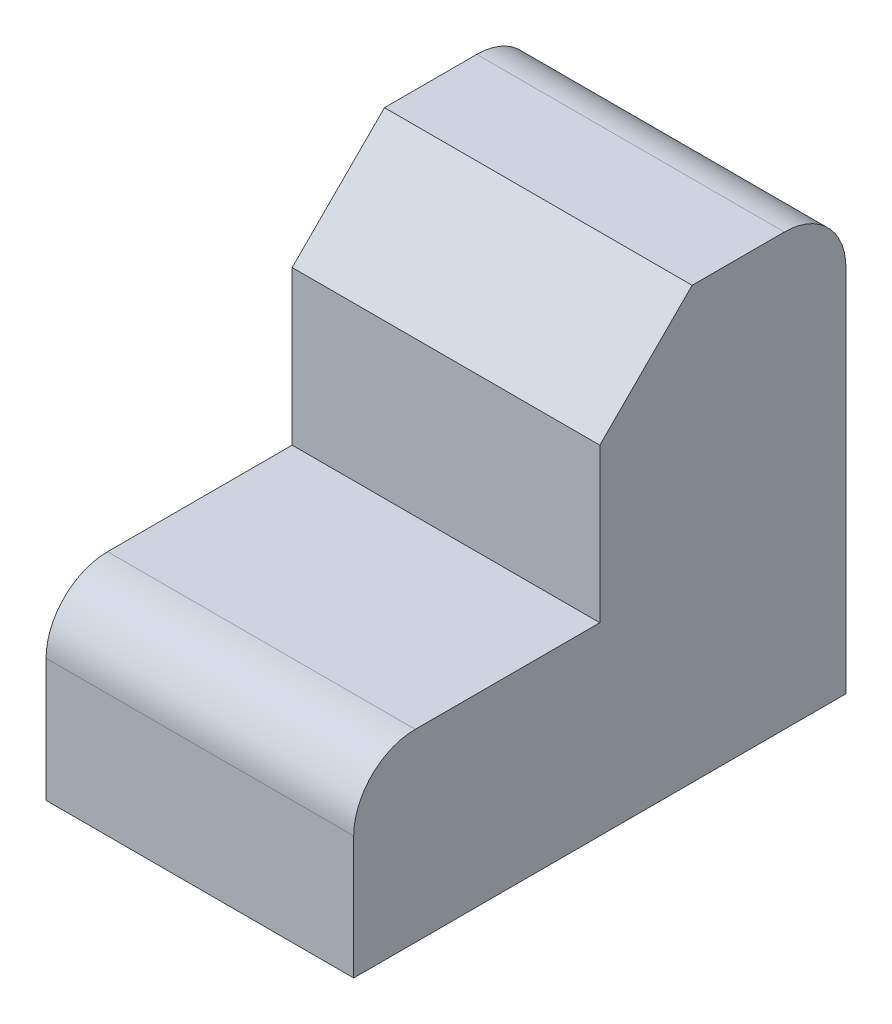
ISO-10303-21;
HEADER;
FILE_DESCRIPTION(('STEP AP214'),'2;1');
FILE_NAME('part.step','',(''),(''),'','','');
FILE_SCHEMA(('AUTOMOTIVE_DESIGN { 1 0 10303 214 1 1 1 1 }'));
ENDSEC;
DATA;
#1=APPLICATION_CONTEXT('core data for automotive mechanical design processes');
#2=APPLICATION_PROTOCOL_DEFINITION('international standard','automotive_design',2000,#1);
#3=PRODUCT_CONTEXT('',#1,'mechanical');
#4=PRODUCT('Part','Part','',(#3));
#5=PRODUCT_RELATED_PRODUCT_CATEGORY('part','',(#4));
#6=PRODUCT_DEFINITION_FORMATION('','',#4);
#7=PRODUCT_DEFINITION_CONTEXT('part definition',#1,'design');
#8=PRODUCT_DEFINITION('design','',#6,#7);
#9=PRODUCT_DEFINITION_SHAPE('','',#8);
#10=(LENGTH_UNIT() NAMED_UNIT(*) SI_UNIT(.MILLI.,.METRE.));
#11=(NAMED_UNIT(*) PLANE_ANGLE_UNIT() SI_UNIT($,.RADIAN.));
#12=(NAMED_UNIT(*) SI_UNIT($,.STERADIAN.) SOLID_ANGLE_UNIT());
#13=UNCERTAINTY_MEASURE_WITH_UNIT(LENGTH_MEASURE(1.E-05),#10,'distance_accuracy_value','');
#14=(GEOMETRIC_REPRESENTATION_CONTEXT(3) GLOBAL_UNCERTAINTY_ASSIGNED_CONTEXT((#13)) GLOBAL_UNIT_ASSIGNED_CONTEXT((#10,
#11,#12)) REPRESENTATION_CONTEXT('',''));
#15=CARTESIAN_POINT('',(0.,0.,0.));
#16=DIRECTION('',(0.,0.,1.));
#17=DIRECTION('',(1.,0.,0.));
#18=AXIS2_PLACEMENT_3D('',#15,#16,#17);
#19=CARTESIAN_POINT('',(0.,70.,0.));
#20=DIRECTION('',(1.,0.,0.));
#21=DIRECTION('',(0.,0.,-1.));
#22=AXIS2_PLACEMENT_3D('',#19,#20,#21);
#23=PLANE('',#22);
#24=DIRECTION('',(0.,0.,1.));
#25=VECTOR('',#24,1.);
#26=CARTESIAN_POINT('',(0.,70.,0.));
#27=LINE('',#26,#25);
#28=CARTESIAN_POINT('',(0.,70.,-70.));
#29=VERTEX_POINT('',#28);
#30=CARTESIAN_POINT('',(0.,70.,-55.));
#31=VERTEX_POINT('',#30);
#32=EDGE_CURVE('E152',#29,#31,#27,.T.);
#33=ORIENTED_EDGE('',*,*,#32,.F.);
#34=CARTESIAN_POINT('',(0.,60.,-70.));
#35=DIRECTION('',(1.,0.,0.));
#36=DIRECTION('',(0.,0.,-1.));
#37=AXIS2_PLACEMENT_3D('',#34,#35,#36);
#38=CIRCLE('',#37,10.);
#39=CARTESIAN_POINT('',(0.,60.,-80.));
#40=VERTEX_POINT('',#39);
#41=EDGE_CURVE('E206',#29,#40,#38,.F.);
#42=ORIENTED_EDGE('',*,*,#41,.T.);
#43=DIRECTION('',(0.,-1.,0.));
#44=VECTOR('',#43,1.);
#45=CARTESIAN_POINT('',(0.,70.,-80.));
#46=LINE('',#45,#44);
#47=CARTESIAN_POINT('',(0.,0.,-80.));
#48=VERTEX_POINT('',#47);
#49=EDGE_CURVE('E160',#40,#48,#46,.T.);
#50=ORIENTED_EDGE('',*,*,#49,.T.);
#51=DIRECTION('',(0.,0.,1.));
#52=VECTOR('',#51,1.);
#53=CARTESIAN_POINT('',(0.,0.,0.));
#54=LINE('',#53,#52);
#55=CARTESIAN_POINT('',(0.,0.,0.));
#56=VERTEX_POINT('',#55);
#57=EDGE_CURVE('E151',#48,#56,#54,.T.);
#58=ORIENTED_EDGE('',*,*,#57,.T.);
#59=DIRECTION('',(0.,-1.,0.));
#60=VECTOR('',#59,1.);
#61=CARTESIAN_POINT('',(0.,70.,0.));
#62=LINE('',#61,#60);
#63=CARTESIAN_POINT('',(0.,20.,0.));
#64=VERTEX_POINT('',#63);
#65=EDGE_CURVE('E183',#64,#56,#62,.T.);
#66=ORIENTED_EDGE('',*,*,#65,.F.);
#67=CARTESIAN_POINT('',(0.,20.,-10.));
#68=DIRECTION('',(1.,0.,0.));
#69=DIRECTION('',(0.,0.,-1.));
#70=AXIS2_PLACEMENT_3D('',#67,#68,#69);
#71=CIRCLE('',#70,10.);
#72=CARTESIAN_POINT('',(0.,30.,-10.));
#73=VERTEX_POINT('',#72);
#74=EDGE_CURVE('E129',#64,#73,#71,.F.);
#75=ORIENTED_EDGE('',*,*,#74,.T.);
#76=DIRECTION('',(0.,0.,-1.));
#77=VECTOR('',#76,1.);
#78=CARTESIAN_POINT('',(0.,30.,0.));
#79=LINE('',#78,#77);
#80=CARTESIAN_POINT('',(0.,30.,-40.));
#81=VERTEX_POINT('',#80);
#82=EDGE_CURVE('E120',#73,#81,#79,.T.);
#83=ORIENTED_EDGE('',*,*,#82,.T.);
#84=DIRECTION('',(0.,1.,0.));
#85=VECTOR('',#84,1.);
#86=CARTESIAN_POINT('',(0.,70.,-40.));
#87=LINE('',#86,#85);
#88=CARTESIAN_POINT('',(0.,55.,-40.));
#89=VERTEX_POINT('',#88);
#90=EDGE_CURVE('E125',#81,#89,#87,.T.);
#91=ORIENTED_EDGE('',*,*,#90,.T.);
#92=DIRECTION('',(0.,-0.707106781186549,0.707106781186546));
#93=VECTOR('',#92,1.);
#94=CARTESIAN_POINT('',(0.,70.,-55.));
#95=LINE('',#94,#93);
#96=EDGE_CURVE('E197',#89,#31,#95,.F.);
#97=ORIENTED_EDGE('',*,*,#96,.T.);
#98=EDGE_LOOP('',(#33,#42,#50,#58,#66,#75,#83,#91,#97));
#99=FACE_BOUND('',#98,.T.);
#100=ADVANCED_FACE('F49',(#99),#23,.F.);
#101=CARTESIAN_POINT('',(0.,70.,0.));
#102=DIRECTION('',(0.,0.,-1.));
#103=DIRECTION('',(-1.,0.,0.));
#104=AXIS2_PLACEMENT_3D('',#101,#102,#103);
#105=PLANE('',#104);
#106=DIRECTION('',(0.,-1.,0.));
#107=VECTOR('',#106,1.);
#108=CARTESIAN_POINT('',(50.,70.,0.));
#109=LINE('',#108,#107);
#110=CARTESIAN_POINT('',(50.,20.,0.));
#111=VERTEX_POINT('',#110);
#112=CARTESIAN_POINT('',(50.,0.,0.));
#113=VERTEX_POINT('',#112);
#114=EDGE_CURVE('E180',#111,#113,#109,.T.);
#115=ORIENTED_EDGE('',*,*,#114,.F.);
#116=DIRECTION('',(1.,0.,0.));
#117=VECTOR('',#116,1.);
#118=CARTESIAN_POINT('',(0.,20.,0.));
#119=LINE('',#118,#117);
#120=EDGE_CURVE('E12',#111,#64,#119,.F.);
#121=ORIENTED_EDGE('',*,*,#120,.T.);
#122=ORIENTED_EDGE('',*,*,#65,.T.);
#123=DIRECTION('',(1.,0.,0.));
#124=VECTOR('',#123,1.);
#125=CARTESIAN_POINT('',(0.,0.,0.));
#126=LINE('',#125,#124);
#127=EDGE_CURVE('E164',#56,#113,#126,.T.);
#128=ORIENTED_EDGE('',*,*,#127,.T.);
#129=EDGE_LOOP('',(#115,#121,#122,#128));
#130=FACE_BOUND('',#129,.T.);
#131=ADVANCED_FACE('F240',(#130),#105,.F.);
#132=CARTESIAN_POINT('',(50.,70.,0.));
#133=DIRECTION('',(-1.,0.,0.));
#134=DIRECTION('',(0.,0.,1.));
#135=AXIS2_PLACEMENT_3D('',#132,#133,#134);
#136=PLANE('',#135);
#137=DIRECTION('',(0.,-1.,0.));
#138=VECTOR('',#137,1.);
#139=CARTESIAN_POINT('',(50.,70.,-80.));
#140=LINE('',#139,#138);
#141=CARTESIAN_POINT('',(50.,60.,-80.));
#142=VERTEX_POINT('',#141);
#143=CARTESIAN_POINT('',(50.,0.,-80.));
#144=VERTEX_POINT('',#143);
#145=EDGE_CURVE('E177',#142,#144,#140,.T.);
#146=ORIENTED_EDGE('',*,*,#145,.F.);
#147=CARTESIAN_POINT('',(50.,60.,-70.));
#148=DIRECTION('',(-1.,0.,0.));
#149=DIRECTION('',(0.,0.,1.));
#150=AXIS2_PLACEMENT_3D('',#147,#148,#149);
#151=CIRCLE('',#150,10.);
#152=CARTESIAN_POINT('',(50.,70.,-70.));
#153=VERTEX_POINT('',#152);
#154=EDGE_CURVE('E214',#142,#153,#151,.F.);
#155=ORIENTED_EDGE('',*,*,#154,.T.);
#156=DIRECTION('',(0.,0.,-1.));
#157=VECTOR('',#156,1.);
#158=CARTESIAN_POINT('',(50.,70.,0.));
#159=LINE('',#158,#157);
#160=CARTESIAN_POINT('',(50.,70.,-55.));
#161=VERTEX_POINT('',#160);
#162=EDGE_CURVE('E155',#161,#153,#159,.T.);
#163=ORIENTED_EDGE('',*,*,#162,.F.);
#164=DIRECTION('',(0.,0.707106781186549,-0.707106781186546));
#165=VECTOR('',#164,1.);
#166=CARTESIAN_POINT('',(50.,70.,-55.));
#167=LINE('',#166,#165);
#168=CARTESIAN_POINT('',(50.,55.,-40.));
#169=VERTEX_POINT('',#168);
#170=EDGE_CURVE('E192',#161,#169,#167,.F.);
#171=ORIENTED_EDGE('',*,*,#170,.T.);
#172=DIRECTION('',(0.,-1.,0.));
#173=VECTOR('',#172,1.);
#174=CARTESIAN_POINT('',(50.,70.,-40.));
#175=LINE('',#174,#173);
#176=CARTESIAN_POINT('',(50.,30.,-40.));
#177=VERTEX_POINT('',#176);
#178=EDGE_CURVE('E141',#169,#177,#175,.T.);
#179=ORIENTED_EDGE('',*,*,#178,.T.);
#180=DIRECTION('',(0.,0.,1.));
#181=VECTOR('',#180,1.);
#182=CARTESIAN_POINT('',(50.,30.,0.));
#183=LINE('',#182,#181);
#184=CARTESIAN_POINT('',(50.,30.,-10.));
#185=VERTEX_POINT('',#184);
#186=EDGE_CURVE('E137',#177,#185,#183,.T.);
#187=ORIENTED_EDGE('',*,*,#186,.T.);
#188=CARTESIAN_POINT('',(50.,20.,-10.));
#189=DIRECTION('',(-1.,0.,0.));
#190=DIRECTION('',(0.,0.,1.));
#191=AXIS2_PLACEMENT_3D('',#188,#189,#190);
#192=CIRCLE('',#191,10.);
#193=EDGE_CURVE('E65',#185,#111,#192,.F.);
#194=ORIENTED_EDGE('',*,*,#193,.T.);
#195=ORIENTED_EDGE('',*,*,#114,.T.);
#196=DIRECTION('',(0.,0.,-1.));
#197=VECTOR('',#196,1.);
#198=CARTESIAN_POINT('',(50.,0.,0.));
#199=LINE('',#198,#197);
#200=EDGE_CURVE('E168',#113,#144,#199,.T.);
#201=ORIENTED_EDGE('',*,*,#200,.T.);
#202=EDGE_LOOP('',(#146,#155,#163,#171,#179,#187,#194,#195,#201));
#203=FACE_BOUND('',#202,.T.);
#204=ADVANCED_FACE('F218',(#203),#136,.F.);
#205=CARTESIAN_POINT('',(0.,70.,-80.));
#206=DIRECTION('',(0.,0.,1.));
#207=DIRECTION('',(1.,0.,0.));
#208=AXIS2_PLACEMENT_3D('',#205,#206,#207);
#209=PLANE('',#208);
#210=ORIENTED_EDGE('',*,*,#49,.F.);
#211=DIRECTION('',(-1.,0.,0.));
#212=VECTOR('',#211,1.);
#213=CARTESIAN_POINT('',(0.,60.,-80.));
#214=LINE('',#213,#212);
#215=EDGE_CURVE('E209',#40,#142,#214,.F.);
#216=ORIENTED_EDGE('',*,*,#215,.T.);
#217=ORIENTED_EDGE('',*,*,#145,.T.);
#218=DIRECTION('',(-1.,0.,0.));
#219=VECTOR('',#218,1.);
#220=CARTESIAN_POINT('',(0.,0.,-80.));
#221=LINE('',#220,#219);
#222=EDGE_CURVE('E156',#144,#48,#221,.T.);
#223=ORIENTED_EDGE('',*,*,#222,.T.);
#224=EDGE_LOOP('',(#210,#216,#217,#223));
#225=FACE_BOUND('',#224,.T.);
#226=ADVANCED_FACE('F232',(#225),#209,.F.);
#227=CARTESIAN_POINT('',(0.,70.,0.));
#228=DIRECTION('',(0.,-1.,0.));
#229=DIRECTION('',(0.,0.,-1.));
#230=AXIS2_PLACEMENT_3D('',#227,#228,#229);
#231=PLANE('',#230);
#232=ORIENTED_EDGE('',*,*,#162,.T.);
#233=DIRECTION('',(-1.,0.,0.));
#234=VECTOR('',#233,1.);
#235=CARTESIAN_POINT('',(0.,70.,-70.));
#236=LINE('',#235,#234);
#237=EDGE_CURVE('E200',#153,#29,#236,.T.);
#238=ORIENTED_EDGE('',*,*,#237,.T.);
#239=ORIENTED_EDGE('',*,*,#32,.T.);
#240=DIRECTION('',(1.,0.,0.));
#241=VECTOR('',#240,1.);
#242=CARTESIAN_POINT('',(0.,70.,-55.));
#243=LINE('',#242,#241);
#244=EDGE_CURVE('E188',#31,#161,#243,.T.);
#245=ORIENTED_EDGE('',*,*,#244,.T.);
#246=EDGE_LOOP('',(#232,#238,#239,#245));
#247=FACE_BOUND('',#246,.T.);
#248=ADVANCED_FACE('F225',(#247),#231,.F.);
#249=CARTESIAN_POINT('',(0.,0.,0.));
#250=DIRECTION('',(0.,-1.,0.));
#251=DIRECTION('',(0.,0.,-1.));
#252=AXIS2_PLACEMENT_3D('',#249,#250,#251);
#253=PLANE('',#252);
#254=ORIENTED_EDGE('',*,*,#57,.F.);
#255=ORIENTED_EDGE('',*,*,#222,.F.);
#256=ORIENTED_EDGE('',*,*,#200,.F.);
#257=ORIENTED_EDGE('',*,*,#127,.F.);
#258=EDGE_LOOP('',(#254,#255,#256,#257));
#259=FACE_BOUND('',#258,.T.);
#260=ADVANCED_FACE('F238',(#259),#253,.T.);
#261=CARTESIAN_POINT('',(0.,30.,0.));
#262=DIRECTION('',(0.,-1.,0.));
#263=DIRECTION('',(0.,0.,-1.));
#264=AXIS2_PLACEMENT_3D('',#261,#262,#263);
#265=PLANE('',#264);
#266=ORIENTED_EDGE('',*,*,#82,.F.);
#267=DIRECTION('',(1.,0.,0.));
#268=VECTOR('',#267,1.);
#269=CARTESIAN_POINT('',(0.,30.,-10.));
#270=LINE('',#269,#268);
#271=EDGE_CURVE('E58',#73,#185,#270,.T.);
#272=ORIENTED_EDGE('',*,*,#271,.T.);
#273=ORIENTED_EDGE('',*,*,#186,.F.);
#274=DIRECTION('',(1.,0.,0.));
#275=VECTOR('',#274,1.);
#276=CARTESIAN_POINT('',(0.,30.,-40.));
#277=LINE('',#276,#275);
#278=EDGE_CURVE('E135',#81,#177,#277,.T.);
#279=ORIENTED_EDGE('',*,*,#278,.F.);
#280=EDGE_LOOP('',(#266,#272,#273,#279));
#281=FACE_BOUND('',#280,.T.);
#282=ADVANCED_FACE('F136',(#281),#265,.F.);
#283=CARTESIAN_POINT('',(0.,70.,-40.));
#284=DIRECTION('',(0.,0.,-1.));
#285=DIRECTION('',(-1.,0.,0.));
#286=AXIS2_PLACEMENT_3D('',#283,#284,#285);
#287=PLANE('',#286);
#288=ORIENTED_EDGE('',*,*,#178,.F.);
#289=DIRECTION('',(-1.,0.,0.));
#290=VECTOR('',#289,1.);
#291=CARTESIAN_POINT('',(0.,55.,-40.));
#292=LINE('',#291,#290);
#293=EDGE_CURVE('E145',#169,#89,#292,.T.);
#294=ORIENTED_EDGE('',*,*,#293,.T.);
#295=ORIENTED_EDGE('',*,*,#90,.F.);
#296=ORIENTED_EDGE('',*,*,#278,.T.);
#297=EDGE_LOOP('',(#288,#294,#295,#296));
#298=FACE_BOUND('',#297,.T.);
#299=ADVANCED_FACE('F143',(#298),#287,.F.);
#300=CARTESIAN_POINT('',(0.,70.,-55.));
#301=DIRECTION('',(0.,-0.707106781186546,-0.707106781186549));
#302=DIRECTION('',(1.,0.,0.));
#303=AXIS2_PLACEMENT_3D('',#300,#301,#302);
#304=PLANE('',#303);
#305=ORIENTED_EDGE('',*,*,#96,.F.);
#306=ORIENTED_EDGE('',*,*,#293,.F.);
#307=ORIENTED_EDGE('',*,*,#170,.F.);
#308=ORIENTED_EDGE('',*,*,#244,.F.);
#309=EDGE_LOOP('',(#305,#306,#307,#308));
#310=FACE_BOUND('',#309,.T.);
#311=ADVANCED_FACE('F221',(#310),#304,.F.);
#312=CARTESIAN_POINT('',(0.,60.,-70.));
#313=DIRECTION('',(-1.,0.,0.));
#314=DIRECTION('',(0.,0.,1.));
#315=AXIS2_PLACEMENT_3D('',#312,#313,#314);
#316=CYLINDRICAL_SURFACE('',#315,10.);
#317=ORIENTED_EDGE('',*,*,#154,.F.);
#318=ORIENTED_EDGE('',*,*,#215,.F.);
#319=ORIENTED_EDGE('',*,*,#41,.F.);
#320=ORIENTED_EDGE('',*,*,#237,.F.);
#321=EDGE_LOOP('',(#317,#318,#319,#320));
#322=FACE_BOUND('',#321,.T.);
#323=ADVANCED_FACE('F229',(#322),#316,.T.);
#324=CARTESIAN_POINT('',(0.,20.,-10.));
#325=DIRECTION('',(1.,0.,0.));
#326=DIRECTION('',(0.,0.,-1.));
#327=AXIS2_PLACEMENT_3D('',#324,#325,#326);
#328=CYLINDRICAL_SURFACE('',#327,10.);
#329=ORIENTED_EDGE('',*,*,#74,.F.);
#330=ORIENTED_EDGE('',*,*,#120,.F.);
#331=ORIENTED_EDGE('',*,*,#193,.F.);
#332=ORIENTED_EDGE('',*,*,#271,.F.);
#333=EDGE_LOOP('',(#329,#330,#331,#332));
#334=FACE_BOUND('',#333,.T.);
#335=ADVANCED_FACE('F51',(#334),#328,.T.);
#336=CLOSED_SHELL('',(#100,#131,#204,#226,#248,#260,#282,#299,#311,#323,#335));
#337=MANIFOLD_SOLID_BREP('B2',#336);
#338=ADVANCED_BREP_SHAPE_REPRESENTATION('',(#18,#337),#14);
#339=SHAPE_DEFINITION_REPRESENTATION(#9,#338);
ENDSEC;
END-ISO-10303-21;
